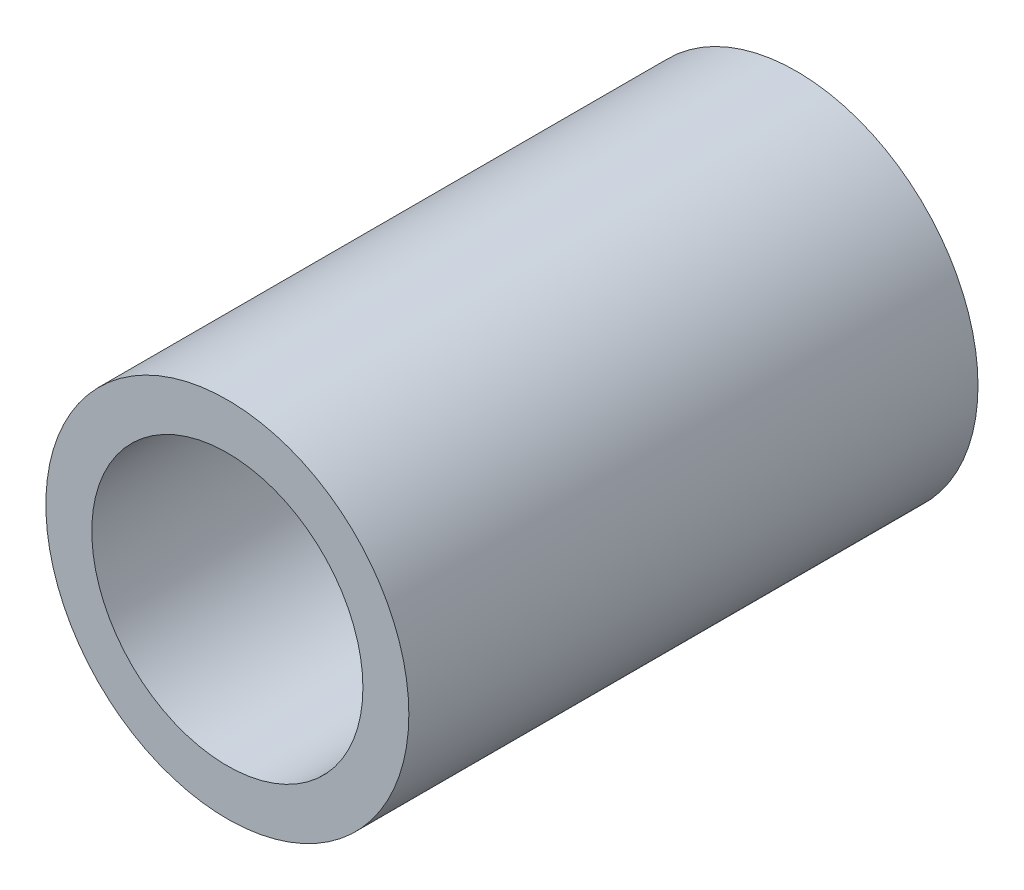
ISO-10303-21;
HEADER;
FILE_DESCRIPTION(('STEP AP214'),'2;1');
FILE_NAME('part.step','',(''),(''),'','','');
FILE_SCHEMA(('AUTOMOTIVE_DESIGN { 1 0 10303 214 1 1 1 1 }'));
ENDSEC;
DATA;
#1=APPLICATION_CONTEXT('core data for automotive mechanical design processes');
#2=APPLICATION_PROTOCOL_DEFINITION('international standard','automotive_design',2000,#1);
#3=PRODUCT_CONTEXT('',#1,'mechanical');
#4=PRODUCT('Part','Part','',(#3));
#5=PRODUCT_RELATED_PRODUCT_CATEGORY('part','',(#4));
#6=PRODUCT_DEFINITION_FORMATION('','',#4);
#7=PRODUCT_DEFINITION_CONTEXT('part definition',#1,'design');
#8=PRODUCT_DEFINITION('design','',#6,#7);
#9=PRODUCT_DEFINITION_SHAPE('','',#8);
#10=(LENGTH_UNIT() NAMED_UNIT(*) SI_UNIT(.MILLI.,.METRE.));
#11=(NAMED_UNIT(*) PLANE_ANGLE_UNIT() SI_UNIT($,.RADIAN.));
#12=(NAMED_UNIT(*) SI_UNIT($,.STERADIAN.) SOLID_ANGLE_UNIT());
#13=UNCERTAINTY_MEASURE_WITH_UNIT(LENGTH_MEASURE(1.E-05),#10,'distance_accuracy_value','');
#14=(GEOMETRIC_REPRESENTATION_CONTEXT(3) GLOBAL_UNCERTAINTY_ASSIGNED_CONTEXT((#13)) GLOBAL_UNIT_ASSIGNED_CONTEXT((#10,
#11,#12)) REPRESENTATION_CONTEXT('',''));
#15=CARTESIAN_POINT('',(0.,0.,0.));
#16=DIRECTION('',(0.,0.,1.));
#17=DIRECTION('',(1.,0.,0.));
#18=AXIS2_PLACEMENT_3D('',#15,#16,#17);
#19=CARTESIAN_POINT('',(0.,0.,12.7));
#20=DIRECTION('',(0.,0.,1.));
#21=DIRECTION('',(1.,0.,0.));
#22=AXIS2_PLACEMENT_3D('',#19,#20,#21);
#23=PLANE('',#22);
#24=CARTESIAN_POINT('',(0.,0.,12.7));
#25=DIRECTION('',(0.,0.,1.));
#26=DIRECTION('',(1.,0.,0.));
#27=AXIS2_PLACEMENT_3D('',#24,#25,#26);
#28=CIRCLE('',#27,4.05);
#29=CARTESIAN_POINT('',(4.05,0.,12.7));
#30=VERTEX_POINT('',#29);
#31=EDGE_CURVE('E10',#30,#30,#28,.T.);
#32=ORIENTED_EDGE('',*,*,#31,.T.);
#33=EDGE_LOOP('',(#32));
#34=FACE_BOUND('',#33,.T.);
#35=CARTESIAN_POINT('',(0.,0.,12.7));
#36=DIRECTION('',(0.,0.,1.));
#37=DIRECTION('',(1.,0.,0.));
#38=AXIS2_PLACEMENT_3D('',#35,#36,#37);
#39=CIRCLE('',#38,3.025);
#40=CARTESIAN_POINT('',(3.025,0.,12.7));
#41=VERTEX_POINT('',#40);
#42=EDGE_CURVE('E48',#41,#41,#39,.T.);
#43=ORIENTED_EDGE('',*,*,#42,.F.);
#44=EDGE_LOOP('',(#43));
#45=FACE_BOUND('',#44,.T.);
#46=ADVANCED_FACE('F40',(#34,#45),#23,.T.);
#47=CARTESIAN_POINT('',(0.,0.,0.));
#48=DIRECTION('',(0.,0.,1.));
#49=DIRECTION('',(1.,0.,0.));
#50=AXIS2_PLACEMENT_3D('',#47,#48,#49);
#51=PLANE('',#50);
#52=CARTESIAN_POINT('',(0.,0.,0.));
#53=DIRECTION('',(0.,0.,1.));
#54=DIRECTION('',(1.,0.,0.));
#55=AXIS2_PLACEMENT_3D('',#52,#53,#54);
#56=CIRCLE('',#55,4.05);
#57=CARTESIAN_POINT('',(4.05,0.,0.));
#58=VERTEX_POINT('',#57);
#59=EDGE_CURVE('E41',#58,#58,#56,.T.);
#60=ORIENTED_EDGE('',*,*,#59,.F.);
#61=EDGE_LOOP('',(#60));
#62=FACE_BOUND('',#61,.T.);
#63=CARTESIAN_POINT('',(0.,0.,0.));
#64=DIRECTION('',(0.,0.,1.));
#65=DIRECTION('',(1.,0.,0.));
#66=AXIS2_PLACEMENT_3D('',#63,#64,#65);
#67=CIRCLE('',#66,3.025);
#68=CARTESIAN_POINT('',(3.025,0.,0.));
#69=VERTEX_POINT('',#68);
#70=EDGE_CURVE('E49',#69,#69,#67,.T.);
#71=ORIENTED_EDGE('',*,*,#70,.T.);
#72=EDGE_LOOP('',(#71));
#73=FACE_BOUND('',#72,.T.);
#74=ADVANCED_FACE('F58',(#62,#73),#51,.F.);
#75=CARTESIAN_POINT('',(0.,0.,12.7));
#76=DIRECTION('',(0.,0.,-1.));
#77=DIRECTION('',(-1.,0.,0.));
#78=AXIS2_PLACEMENT_3D('',#75,#76,#77);
#79=CYLINDRICAL_SURFACE('',#78,4.05);
#80=ORIENTED_EDGE('',*,*,#31,.F.);
#81=EDGE_LOOP('',(#80));
#82=FACE_BOUND('',#81,.T.);
#83=ORIENTED_EDGE('',*,*,#59,.T.);
#84=EDGE_LOOP('',(#83));
#85=FACE_BOUND('',#84,.T.);
#86=ADVANCED_FACE('F39',(#82,#85),#79,.T.);
#87=CARTESIAN_POINT('',(0.,0.,12.7));
#88=DIRECTION('',(0.,0.,-1.));
#89=DIRECTION('',(-1.,0.,0.));
#90=AXIS2_PLACEMENT_3D('',#87,#88,#89);
#91=CYLINDRICAL_SURFACE('',#90,3.025);
#92=ORIENTED_EDGE('',*,*,#42,.T.);
#93=EDGE_LOOP('',(#92));
#94=FACE_BOUND('',#93,.T.);
#95=ORIENTED_EDGE('',*,*,#70,.F.);
#96=EDGE_LOOP('',(#95));
#97=FACE_BOUND('',#96,.T.);
#98=ADVANCED_FACE('F57',(#94,#97),#91,.F.);
#99=CLOSED_SHELL('',(#46,#74,#86,#98));
#100=MANIFOLD_SOLID_BREP('B2',#99);
#101=ADVANCED_BREP_SHAPE_REPRESENTATION('',(#18,#100),#14);
#102=SHAPE_DEFINITION_REPRESENTATION(#9,#101);
ENDSEC;
END-ISO-10303-21;
